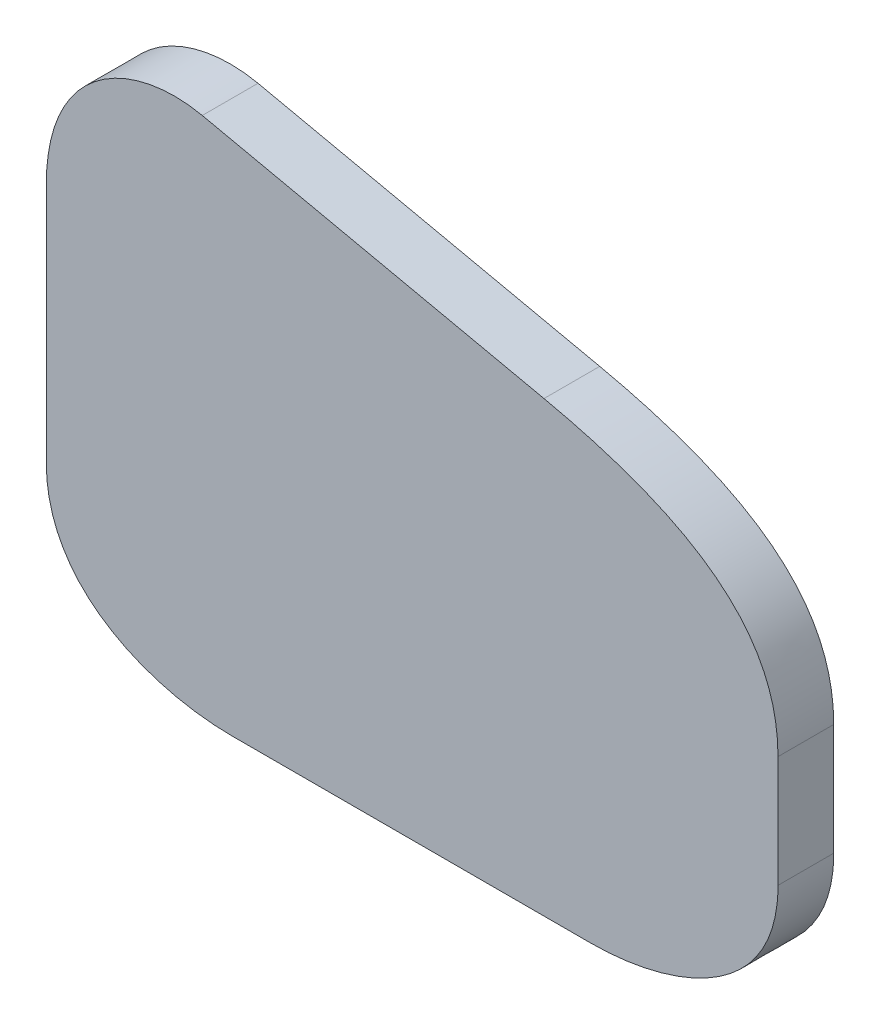
ISO-10303-21;
HEADER;
FILE_DESCRIPTION(('STEP AP214'),'2;1');
FILE_NAME('part.step','',(''),(''),'','','');
FILE_SCHEMA(('AUTOMOTIVE_DESIGN { 1 0 10303 214 1 1 1 1 }'));
ENDSEC;
DATA;
#1=APPLICATION_CONTEXT('core data for automotive mechanical design processes');
#2=APPLICATION_PROTOCOL_DEFINITION('international standard','automotive_design',2000,#1);
#3=PRODUCT_CONTEXT('',#1,'mechanical');
#4=PRODUCT('Part','Part','',(#3));
#5=PRODUCT_RELATED_PRODUCT_CATEGORY('part','',(#4));
#6=PRODUCT_DEFINITION_FORMATION('','',#4);
#7=PRODUCT_DEFINITION_CONTEXT('part definition',#1,'design');
#8=PRODUCT_DEFINITION('design','',#6,#7);
#9=PRODUCT_DEFINITION_SHAPE('','',#8);
#10=(LENGTH_UNIT() NAMED_UNIT(*) SI_UNIT(.MILLI.,.METRE.));
#11=(NAMED_UNIT(*) PLANE_ANGLE_UNIT() SI_UNIT($,.RADIAN.));
#12=(NAMED_UNIT(*) SI_UNIT($,.STERADIAN.) SOLID_ANGLE_UNIT());
#13=UNCERTAINTY_MEASURE_WITH_UNIT(LENGTH_MEASURE(1.E-05),#10,'distance_accuracy_value','');
#14=(GEOMETRIC_REPRESENTATION_CONTEXT(3) GLOBAL_UNCERTAINTY_ASSIGNED_CONTEXT((#13)) GLOBAL_UNIT_ASSIGNED_CONTEXT((#10,
#11,#12)) REPRESENTATION_CONTEXT('',''));
#15=CARTESIAN_POINT('',(0.,0.,0.));
#16=DIRECTION('',(0.,0.,1.));
#17=DIRECTION('',(1.,0.,0.));
#18=AXIS2_PLACEMENT_3D('',#15,#16,#17);
#19=CARTESIAN_POINT('',(-33.5451291028447,-25.7697680525164,10.));
#20=CARTESIAN_POINT('',(-19.4448665678301,-25.7697680525164,10.));
#21=CARTESIAN_POINT('',(0.,-19.0637574545764,10.));
#22=CARTESIAN_POINT('',(0.,0.,10.));
#23=B_SPLINE_CURVE_WITH_KNOTS('',3,(#19,#20,#21,#22),.UNSPECIFIED.,.F.,.F.,(4,4),(0.,1.),.UNSPECIFIED.);
#24=DIRECTION('',(0.,0.,-1.));
#25=VECTOR('',#24,1.);
#26=SURFACE_OF_LINEAR_EXTRUSION('',#23,#25);
#27=CARTESIAN_POINT('',(-33.5451291028447,-25.7697680525164,0.));
#28=CARTESIAN_POINT('',(-19.4448665678301,-25.7697680525164,0.));
#29=CARTESIAN_POINT('',(0.,-19.0637574545764,0.));
#30=CARTESIAN_POINT('',(0.,0.,0.));
#31=B_SPLINE_CURVE_WITH_KNOTS('',3,(#27,#28,#29,#30),.UNSPECIFIED.,.F.,.F.,(4,4),(0.,1.),.UNSPECIFIED.);
#32=CARTESIAN_POINT('',(-33.5451291028447,-25.7697680525164,0.));
#33=VERTEX_POINT('',#32);
#34=CARTESIAN_POINT('',(0.,0.,0.));
#35=VERTEX_POINT('',#34);
#36=EDGE_CURVE('E188',#33,#35,#31,.T.);
#37=ORIENTED_EDGE('',*,*,#36,.T.);
#38=DIRECTION('',(0.,0.,-1.));
#39=VECTOR('',#38,1.);
#40=CARTESIAN_POINT('',(0.,0.,10.));
#41=LINE('',#40,#39);
#42=CARTESIAN_POINT('',(0.,0.,10.));
#43=VERTEX_POINT('',#42);
#44=EDGE_CURVE('E11',#43,#35,#41,.T.);
#45=ORIENTED_EDGE('',*,*,#44,.F.);
#46=CARTESIAN_POINT('',(-33.5451291028447,-25.7697680525164,10.));
#47=VERTEX_POINT('',#46);
#48=EDGE_CURVE('E220',#47,#43,#23,.T.);
#49=ORIENTED_EDGE('',*,*,#48,.F.);
#50=DIRECTION('',(0.,0.,-1.));
#51=VECTOR('',#50,1.);
#52=CARTESIAN_POINT('',(-33.5451291028447,-25.7697680525164,10.));
#53=LINE('',#52,#51);
#54=EDGE_CURVE('E129',#47,#33,#53,.T.);
#55=ORIENTED_EDGE('',*,*,#54,.T.);
#56=EDGE_LOOP('',(#37,#45,#49,#55));
#57=FACE_BOUND('',#56,.T.);
#58=ADVANCED_FACE('F36',(#57),#26,.F.);
#59=CARTESIAN_POINT('',(0.,0.,10.));
#60=DIRECTION('',(-1.,0.,0.));
#61=DIRECTION('',(0.,0.,1.));
#62=AXIS2_PLACEMENT_3D('',#59,#60,#61);
#63=PLANE('',#62);
#64=DIRECTION('',(0.,1.,0.));
#65=VECTOR('',#64,1.);
#66=CARTESIAN_POINT('',(0.,0.,0.));
#67=LINE('',#66,#65);
#68=CARTESIAN_POINT('',(0.,20.,0.));
#69=VERTEX_POINT('',#68);
#70=EDGE_CURVE('E179',#35,#69,#67,.T.);
#71=ORIENTED_EDGE('',*,*,#70,.T.);
#72=DIRECTION('',(0.,0.,-1.));
#73=VECTOR('',#72,1.);
#74=CARTESIAN_POINT('',(0.,20.,10.));
#75=LINE('',#74,#73);
#76=CARTESIAN_POINT('',(0.,20.,10.));
#77=VERTEX_POINT('',#76);
#78=EDGE_CURVE('E45',#77,#69,#75,.T.);
#79=ORIENTED_EDGE('',*,*,#78,.F.);
#80=DIRECTION('',(0.,1.,0.));
#81=VECTOR('',#80,1.);
#82=CARTESIAN_POINT('',(0.,0.,10.));
#83=LINE('',#82,#81);
#84=EDGE_CURVE('E96',#43,#77,#83,.T.);
#85=ORIENTED_EDGE('',*,*,#84,.F.);
#86=ORIENTED_EDGE('',*,*,#44,.T.);
#87=EDGE_LOOP('',(#71,#79,#85,#86));
#88=FACE_BOUND('',#87,.T.);
#89=ADVANCED_FACE('F172',(#88),#63,.F.);
#90=CARTESIAN_POINT('',(0.,20.,10.));
#91=CARTESIAN_POINT('',(0.,38.1460258986672,10.));
#92=CARTESIAN_POINT('',(-14.2094741821754,48.6110988969908,10.));
#93=CARTESIAN_POINT('',(-41.9869496717725,54.6496805251641,10.));
#94=B_SPLINE_CURVE_WITH_KNOTS('',3,(#90,#91,#92,#93),.UNSPECIFIED.,.F.,.F.,(4,4),(0.,1.),.UNSPECIFIED.);
#95=DIRECTION('',(0.,0.,-1.));
#96=VECTOR('',#95,1.);
#97=SURFACE_OF_LINEAR_EXTRUSION('',#94,#96);
#98=CARTESIAN_POINT('',(0.,20.,0.));
#99=CARTESIAN_POINT('',(0.,38.1460258986672,0.));
#100=CARTESIAN_POINT('',(-14.2094741821754,48.6110988969908,0.));
#101=CARTESIAN_POINT('',(-41.9869496717725,54.6496805251641,0.));
#102=B_SPLINE_CURVE_WITH_KNOTS('',3,(#98,#99,#100,#101),.UNSPECIFIED.,.F.,.F.,(4,4),(0.,1.),.UNSPECIFIED.);
#103=CARTESIAN_POINT('',(-41.9869496717725,54.6496805251641,0.));
#104=VERTEX_POINT('',#103);
#105=EDGE_CURVE('E187',#69,#104,#102,.T.);
#106=ORIENTED_EDGE('',*,*,#105,.T.);
#107=DIRECTION('',(0.,0.,-1.));
#108=VECTOR('',#107,1.);
#109=CARTESIAN_POINT('',(-41.9869496717725,54.6496805251641,10.));
#110=LINE('',#109,#108);
#111=CARTESIAN_POINT('',(-41.9869496717725,54.6496805251641,10.));
#112=VERTEX_POINT('',#111);
#113=EDGE_CURVE('E192',#112,#104,#110,.T.);
#114=ORIENTED_EDGE('',*,*,#113,.F.);
#115=EDGE_CURVE('E162',#77,#112,#94,.T.);
#116=ORIENTED_EDGE('',*,*,#115,.F.);
#117=ORIENTED_EDGE('',*,*,#78,.T.);
#118=EDGE_LOOP('',(#106,#114,#116,#117));
#119=FACE_BOUND('',#118,.T.);
#120=ADVANCED_FACE('F170',(#119),#97,.F.);
#121=CARTESIAN_POINT('',(-41.9869496717725,54.6496805251641,10.));
#122=DIRECTION('',(-0.212429644331044,-0.977176363922801,0.));
#123=DIRECTION('',(0.977176363922801,-0.212429644331044,0.));
#124=AXIS2_PLACEMENT_3D('',#121,#122,#123);
#125=PLANE('',#124);
#126=DIRECTION('',(-0.977176363922801,0.212429644331044,0.));
#127=VECTOR('',#126,1.);
#128=CARTESIAN_POINT('',(-41.9869496717725,54.6496805251641,0.));
#129=LINE('',#128,#127);
#130=CARTESIAN_POINT('',(-103.301225382932,67.9788708971554,0.));
#131=VERTEX_POINT('',#130);
#132=EDGE_CURVE('E196',#104,#131,#129,.T.);
#133=ORIENTED_EDGE('',*,*,#132,.T.);
#134=DIRECTION('',(0.,0.,-1.));
#135=VECTOR('',#134,1.);
#136=CARTESIAN_POINT('',(-103.301225382932,67.9788708971554,10.));
#137=LINE('',#136,#135);
#138=CARTESIAN_POINT('',(-103.301225382932,67.9788708971554,10.));
#139=VERTEX_POINT('',#138);
#140=EDGE_CURVE('E224',#139,#131,#137,.T.);
#141=ORIENTED_EDGE('',*,*,#140,.F.);
#142=DIRECTION('',(-0.977176363922801,0.212429644331044,0.));
#143=VECTOR('',#142,1.);
#144=CARTESIAN_POINT('',(-41.9869496717725,54.6496805251641,10.));
#145=LINE('',#144,#143);
#146=EDGE_CURVE('E157',#112,#139,#145,.T.);
#147=ORIENTED_EDGE('',*,*,#146,.F.);
#148=ORIENTED_EDGE('',*,*,#113,.T.);
#149=EDGE_LOOP('',(#133,#141,#147,#148));
#150=FACE_BOUND('',#149,.T.);
#151=ADVANCED_FACE('F150',(#150),#125,.F.);
#152=CARTESIAN_POINT('',(-103.301225382932,67.9788708971554,10.));
#153=CARTESIAN_POINT('',(-115.500001367253,70.6307787198339,10.));
#154=CARTESIAN_POINT('',(-131.292525164114,63.3933061839038,10.));
#155=CARTESIAN_POINT('',(-131.292525164114,43.097715536105,10.));
#156=B_SPLINE_CURVE_WITH_KNOTS('',3,(#152,#153,#154,#155),.UNSPECIFIED.,.F.,.F.,(4,4),(0.,1.),.UNSPECIFIED.);
#157=DIRECTION('',(0.,0.,-1.));
#158=VECTOR('',#157,1.);
#159=SURFACE_OF_LINEAR_EXTRUSION('',#156,#158);
#160=CARTESIAN_POINT('',(-103.301225382932,67.9788708971554,0.));
#161=CARTESIAN_POINT('',(-115.500001367253,70.6307787198339,0.));
#162=CARTESIAN_POINT('',(-131.292525164114,63.3933061839038,0.));
#163=CARTESIAN_POINT('',(-131.292525164114,43.097715536105,0.));
#164=B_SPLINE_CURVE_WITH_KNOTS('',3,(#160,#161,#162,#163),.UNSPECIFIED.,.F.,.F.,(4,4),(0.,1.),.UNSPECIFIED.);
#165=CARTESIAN_POINT('',(-131.292525164114,43.097715536105,0.));
#166=VERTEX_POINT('',#165);
#167=EDGE_CURVE('E198',#131,#166,#164,.T.);
#168=ORIENTED_EDGE('',*,*,#167,.T.);
#169=DIRECTION('',(0.,0.,-1.));
#170=VECTOR('',#169,1.);
#171=CARTESIAN_POINT('',(-131.292525164114,43.097715536105,10.));
#172=LINE('',#171,#170);
#173=CARTESIAN_POINT('',(-131.292525164114,43.097715536105,10.));
#174=VERTEX_POINT('',#173);
#175=EDGE_CURVE('E124',#174,#166,#172,.T.);
#176=ORIENTED_EDGE('',*,*,#175,.F.);
#177=EDGE_CURVE('E115',#139,#174,#156,.T.);
#178=ORIENTED_EDGE('',*,*,#177,.F.);
#179=ORIENTED_EDGE('',*,*,#140,.T.);
#180=EDGE_LOOP('',(#168,#176,#178,#179));
#181=FACE_BOUND('',#180,.T.);
#182=ADVANCED_FACE('F147',(#181),#159,.F.);
#183=CARTESIAN_POINT('',(-131.292525164114,43.097715536105,10.));
#184=DIRECTION('',(1.,0.,0.));
#185=DIRECTION('',(0.,0.,-1.));
#186=AXIS2_PLACEMENT_3D('',#183,#184,#185);
#187=PLANE('',#186);
#188=DIRECTION('',(0.,-1.,0.));
#189=VECTOR('',#188,1.);
#190=CARTESIAN_POINT('',(-131.292525164114,43.097715536105,0.));
#191=LINE('',#190,#189);
#192=CARTESIAN_POINT('',(-131.292525164114,0.,0.));
#193=VERTEX_POINT('',#192);
#194=EDGE_CURVE('E123',#166,#193,#191,.T.);
#195=ORIENTED_EDGE('',*,*,#194,.T.);
#196=DIRECTION('',(0.,0.,-1.));
#197=VECTOR('',#196,1.);
#198=CARTESIAN_POINT('',(-131.292525164114,0.,10.));
#199=LINE('',#198,#197);
#200=CARTESIAN_POINT('',(-131.292525164114,0.,10.));
#201=VERTEX_POINT('',#200);
#202=EDGE_CURVE('E120',#201,#193,#199,.T.);
#203=ORIENTED_EDGE('',*,*,#202,.F.);
#204=DIRECTION('',(0.,-1.,0.));
#205=VECTOR('',#204,1.);
#206=CARTESIAN_POINT('',(-131.292525164114,43.097715536105,10.));
#207=LINE('',#206,#205);
#208=EDGE_CURVE('E109',#174,#201,#207,.T.);
#209=ORIENTED_EDGE('',*,*,#208,.F.);
#210=ORIENTED_EDGE('',*,*,#175,.T.);
#211=EDGE_LOOP('',(#195,#203,#209,#210));
#212=FACE_BOUND('',#211,.T.);
#213=ADVANCED_FACE('F121',(#212),#187,.F.);
#214=CARTESIAN_POINT('',(-131.292525164114,0.,10.));
#215=CARTESIAN_POINT('',(-131.292525164114,-19.0251558180361,10.));
#216=CARTESIAN_POINT('',(-112.011160689261,-25.7697680525164,10.));
#217=CARTESIAN_POINT('',(-97.9695492341357,-25.7697680525164,10.));
#218=B_SPLINE_CURVE_WITH_KNOTS('',3,(#214,#215,#216,#217),.UNSPECIFIED.,.F.,.F.,(4,4),(0.,1.),.UNSPECIFIED.);
#219=DIRECTION('',(0.,0.,-1.));
#220=VECTOR('',#219,1.);
#221=SURFACE_OF_LINEAR_EXTRUSION('',#218,#220);
#222=CARTESIAN_POINT('',(-131.292525164114,0.,0.));
#223=CARTESIAN_POINT('',(-131.292525164114,-19.0251558180361,0.));
#224=CARTESIAN_POINT('',(-112.011160689261,-25.7697680525164,0.));
#225=CARTESIAN_POINT('',(-97.9695492341357,-25.7697680525164,0.));
#226=B_SPLINE_CURVE_WITH_KNOTS('',3,(#222,#223,#224,#225),.UNSPECIFIED.,.F.,.F.,(4,4),(0.,1.),.UNSPECIFIED.);
#227=CARTESIAN_POINT('',(-97.9695492341357,-25.7697680525164,0.));
#228=VERTEX_POINT('',#227);
#229=EDGE_CURVE('E82',#193,#228,#226,.T.);
#230=ORIENTED_EDGE('',*,*,#229,.T.);
#231=DIRECTION('',(0.,0.,-1.));
#232=VECTOR('',#231,1.);
#233=CARTESIAN_POINT('',(-97.9695492341357,-25.7697680525164,10.));
#234=LINE('',#233,#232);
#235=CARTESIAN_POINT('',(-97.9695492341357,-25.7697680525164,10.));
#236=VERTEX_POINT('',#235);
#237=EDGE_CURVE('E125',#236,#228,#234,.T.);
#238=ORIENTED_EDGE('',*,*,#237,.F.);
#239=EDGE_CURVE('E113',#201,#236,#218,.T.);
#240=ORIENTED_EDGE('',*,*,#239,.F.);
#241=ORIENTED_EDGE('',*,*,#202,.T.);
#242=EDGE_LOOP('',(#230,#238,#240,#241));
#243=FACE_BOUND('',#242,.T.);
#244=ADVANCED_FACE('F127',(#243),#221,.F.);
#245=CARTESIAN_POINT('',(-33.5451291028447,-25.7697680525164,10.));
#246=DIRECTION('',(0.,1.,0.));
#247=DIRECTION('',(0.,0.,1.));
#248=AXIS2_PLACEMENT_3D('',#245,#246,#247);
#249=PLANE('',#248);
#250=DIRECTION('',(1.,0.,0.));
#251=VECTOR('',#250,1.);
#252=CARTESIAN_POINT('',(-33.5451291028447,-25.7697680525164,0.));
#253=LINE('',#252,#251);
#254=EDGE_CURVE('E88',#228,#33,#253,.T.);
#255=ORIENTED_EDGE('',*,*,#254,.T.);
#256=ORIENTED_EDGE('',*,*,#54,.F.);
#257=DIRECTION('',(1.,0.,0.));
#258=VECTOR('',#257,1.);
#259=CARTESIAN_POINT('',(-33.5451291028447,-25.7697680525164,10.));
#260=LINE('',#259,#258);
#261=EDGE_CURVE('E53',#236,#47,#260,.T.);
#262=ORIENTED_EDGE('',*,*,#261,.F.);
#263=ORIENTED_EDGE('',*,*,#237,.T.);
#264=EDGE_LOOP('',(#255,#256,#262,#263));
#265=FACE_BOUND('',#264,.T.);
#266=ADVANCED_FACE('F143',(#265),#249,.F.);
#267=CARTESIAN_POINT('',(-11.4849661007919,-20.0337930717244,10.));
#268=DIRECTION('',(0.,0.,-1.));
#269=DIRECTION('',(-1.,0.,0.));
#270=AXIS2_PLACEMENT_3D('',#267,#268,#269);
#271=PLANE('',#270);
#272=ORIENTED_EDGE('',*,*,#48,.T.);
#273=ORIENTED_EDGE('',*,*,#84,.T.);
#274=ORIENTED_EDGE('',*,*,#115,.T.);
#275=ORIENTED_EDGE('',*,*,#146,.T.);
#276=ORIENTED_EDGE('',*,*,#177,.T.);
#277=ORIENTED_EDGE('',*,*,#208,.T.);
#278=ORIENTED_EDGE('',*,*,#239,.T.);
#279=ORIENTED_EDGE('',*,*,#261,.T.);
#280=EDGE_LOOP('',(#272,#273,#274,#275,#276,#277,#278,#279));
#281=FACE_BOUND('',#280,.T.);
#282=ADVANCED_FACE('F111',(#281),#271,.F.);
#283=CARTESIAN_POINT('',(-11.4849661007919,-20.0337930717244,0.));
#284=DIRECTION('',(0.,0.,-1.));
#285=DIRECTION('',(-1.,0.,0.));
#286=AXIS2_PLACEMENT_3D('',#283,#284,#285);
#287=PLANE('',#286);
#288=ORIENTED_EDGE('',*,*,#36,.F.);
#289=ORIENTED_EDGE('',*,*,#254,.F.);
#290=ORIENTED_EDGE('',*,*,#229,.F.);
#291=ORIENTED_EDGE('',*,*,#194,.F.);
#292=ORIENTED_EDGE('',*,*,#167,.F.);
#293=ORIENTED_EDGE('',*,*,#132,.F.);
#294=ORIENTED_EDGE('',*,*,#105,.F.);
#295=ORIENTED_EDGE('',*,*,#70,.F.);
#296=EDGE_LOOP('',(#288,#289,#290,#291,#292,#293,#294,#295));
#297=FACE_BOUND('',#296,.T.);
#298=ADVANCED_FACE('F194',(#297),#287,.T.);
#299=CLOSED_SHELL('',(#58,#89,#120,#151,#182,#213,#244,#266,#282,#298));
#300=MANIFOLD_SOLID_BREP('B2',#299);
#301=ADVANCED_BREP_SHAPE_REPRESENTATION('',(#18,#300),#14);
#302=SHAPE_DEFINITION_REPRESENTATION(#9,#301);
ENDSEC;
END-ISO-10303-21;
